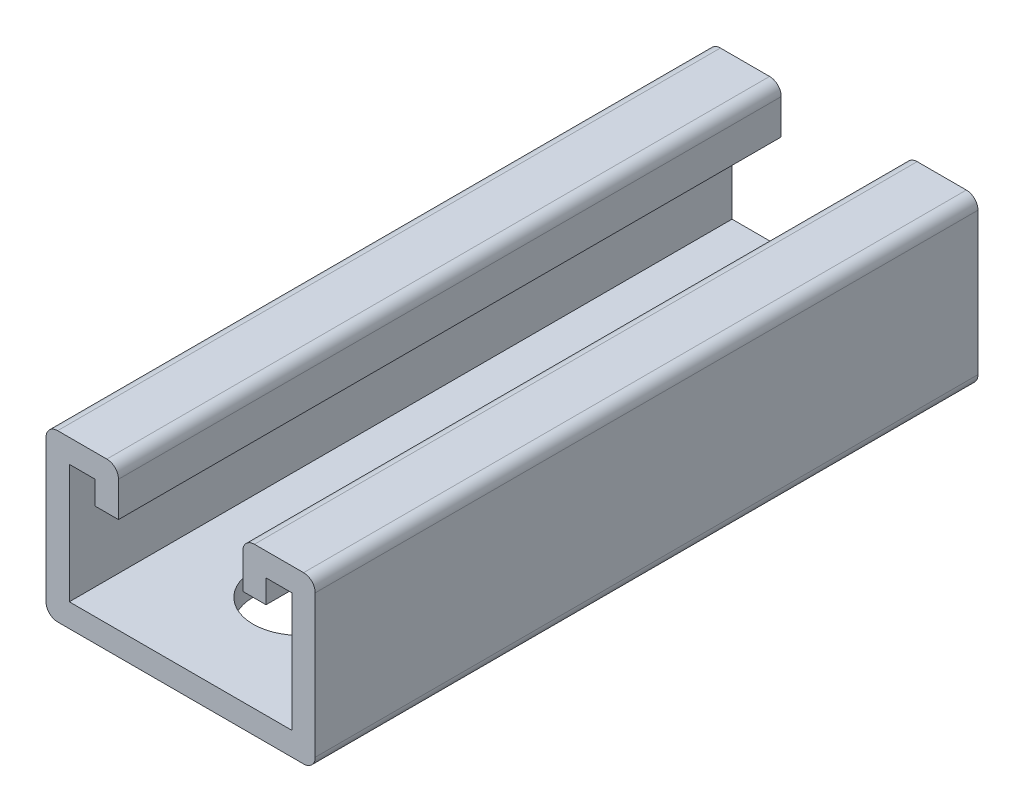
ISO-10303-21;
HEADER;
FILE_DESCRIPTION(('STEP AP214'),'2;1');
FILE_NAME('part.step','',(''),(''),'','','');
FILE_SCHEMA(('AUTOMOTIVE_DESIGN { 1 0 10303 214 1 1 1 1 }'));
ENDSEC;
DATA;
#1=APPLICATION_CONTEXT('core data for automotive mechanical design processes');
#2=APPLICATION_PROTOCOL_DEFINITION('international standard','automotive_design',2000,#1);
#3=PRODUCT_CONTEXT('',#1,'mechanical');
#4=PRODUCT('Part','Part','',(#3));
#5=PRODUCT_RELATED_PRODUCT_CATEGORY('part','',(#4));
#6=PRODUCT_DEFINITION_FORMATION('','',#4);
#7=PRODUCT_DEFINITION_CONTEXT('part definition',#1,'design');
#8=PRODUCT_DEFINITION('design','',#6,#7);
#9=PRODUCT_DEFINITION_SHAPE('','',#8);
#10=(LENGTH_UNIT() NAMED_UNIT(*) SI_UNIT(.MILLI.,.METRE.));
#11=(NAMED_UNIT(*) PLANE_ANGLE_UNIT() SI_UNIT($,.RADIAN.));
#12=(NAMED_UNIT(*) SI_UNIT($,.STERADIAN.) SOLID_ANGLE_UNIT());
#13=UNCERTAINTY_MEASURE_WITH_UNIT(LENGTH_MEASURE(1.E-05),#10,'distance_accuracy_value','');
#14=(GEOMETRIC_REPRESENTATION_CONTEXT(3) GLOBAL_UNCERTAINTY_ASSIGNED_CONTEXT((#13)) GLOBAL_UNIT_ASSIGNED_CONTEXT((#10,
#11,#12)) REPRESENTATION_CONTEXT('',''));
#15=CARTESIAN_POINT('',(0.,0.,0.));
#16=DIRECTION('',(0.,0.,1.));
#17=DIRECTION('',(1.,0.,0.));
#18=AXIS2_PLACEMENT_3D('',#15,#16,#17);
#19=CARTESIAN_POINT('',(9.525,5.55625,101.6));
#20=DIRECTION('',(0.,1.,0.));
#21=DIRECTION('',(0.,0.,1.));
#22=AXIS2_PLACEMENT_3D('',#19,#20,#21);
#23=PLANE('',#22);
#24=DIRECTION('',(1.,0.,0.));
#25=VECTOR('',#24,1.);
#26=CARTESIAN_POINT('',(9.525,5.55625,0.));
#27=LINE('',#26,#25);
#28=CARTESIAN_POINT('',(9.525,5.55625,0.));
#29=VERTEX_POINT('',#28);
#30=CARTESIAN_POINT('',(13.096875,5.55625,0.));
#31=VERTEX_POINT('',#30);
#32=EDGE_CURVE('E295',#29,#31,#27,.T.);
#33=ORIENTED_EDGE('',*,*,#32,.T.);
#34=DIRECTION('',(0.,0.,-1.));
#35=VECTOR('',#34,1.);
#36=CARTESIAN_POINT('',(13.096875,5.55625,101.6));
#37=LINE('',#36,#35);
#38=CARTESIAN_POINT('',(13.096875,5.55625,101.6));
#39=VERTEX_POINT('',#38);
#40=EDGE_CURVE('E11',#39,#31,#37,.T.);
#41=ORIENTED_EDGE('',*,*,#40,.F.);
#42=DIRECTION('',(1.,0.,0.));
#43=VECTOR('',#42,1.);
#44=CARTESIAN_POINT('',(9.525,5.55625,101.6));
#45=LINE('',#44,#43);
#46=CARTESIAN_POINT('',(9.525,5.55625,101.6));
#47=VERTEX_POINT('',#46);
#48=EDGE_CURVE('E296',#47,#39,#45,.T.);
#49=ORIENTED_EDGE('',*,*,#48,.F.);
#50=DIRECTION('',(0.,0.,-1.));
#51=VECTOR('',#50,1.);
#52=CARTESIAN_POINT('',(9.525,5.55625,101.6));
#53=LINE('',#52,#51);
#54=EDGE_CURVE('E342',#47,#29,#53,.T.);
#55=ORIENTED_EDGE('',*,*,#54,.T.);
#56=EDGE_LOOP('',(#33,#41,#49,#55));
#57=FACE_BOUND('',#56,.T.);
#58=ADVANCED_FACE('F32',(#57),#23,.F.);
#59=CARTESIAN_POINT('',(13.096875,9.128125,101.6));
#60=DIRECTION('',(-1.,0.,0.));
#61=DIRECTION('',(0.,0.,1.));
#62=AXIS2_PLACEMENT_3D('',#59,#60,#61);
#63=PLANE('',#62);
#64=DIRECTION('',(0.,1.,0.));
#65=VECTOR('',#64,1.);
#66=CARTESIAN_POINT('',(13.096875,9.128125,0.));
#67=LINE('',#66,#65);
#68=CARTESIAN_POINT('',(13.096875,9.128125,0.));
#69=VERTEX_POINT('',#68);
#70=EDGE_CURVE('E345',#31,#69,#67,.T.);
#71=ORIENTED_EDGE('',*,*,#70,.T.);
#72=DIRECTION('',(0.,0.,-1.));
#73=VECTOR('',#72,1.);
#74=CARTESIAN_POINT('',(13.096875,9.128125,101.6));
#75=LINE('',#74,#73);
#76=CARTESIAN_POINT('',(13.096875,9.128125,101.6));
#77=VERTEX_POINT('',#76);
#78=EDGE_CURVE('E39',#77,#69,#75,.T.);
#79=ORIENTED_EDGE('',*,*,#78,.F.);
#80=DIRECTION('',(0.,1.,0.));
#81=VECTOR('',#80,1.);
#82=CARTESIAN_POINT('',(13.096875,9.128125,101.6));
#83=LINE('',#82,#81);
#84=EDGE_CURVE('E299',#39,#77,#83,.T.);
#85=ORIENTED_EDGE('',*,*,#84,.F.);
#86=ORIENTED_EDGE('',*,*,#40,.T.);
#87=EDGE_LOOP('',(#71,#79,#85,#86));
#88=FACE_BOUND('',#87,.T.);
#89=ADVANCED_FACE('F472',(#88),#63,.F.);
#90=CARTESIAN_POINT('',(17.065625,9.128125,101.6));
#91=DIRECTION('',(0.,1.,0.));
#92=DIRECTION('',(0.,0.,1.));
#93=AXIS2_PLACEMENT_3D('',#90,#91,#92);
#94=PLANE('',#93);
#95=DIRECTION('',(1.,0.,0.));
#96=VECTOR('',#95,1.);
#97=CARTESIAN_POINT('',(17.065625,9.128125,0.));
#98=LINE('',#97,#96);
#99=CARTESIAN_POINT('',(17.065625,9.128125,0.));
#100=VERTEX_POINT('',#99);
#101=EDGE_CURVE('E347',#69,#100,#98,.T.);
#102=ORIENTED_EDGE('',*,*,#101,.T.);
#103=DIRECTION('',(0.,0.,-1.));
#104=VECTOR('',#103,1.);
#105=CARTESIAN_POINT('',(17.065625,9.128125,101.6));
#106=LINE('',#105,#104);
#107=CARTESIAN_POINT('',(17.065625,9.128125,101.6));
#108=VERTEX_POINT('',#107);
#109=EDGE_CURVE('E442',#108,#100,#106,.T.);
#110=ORIENTED_EDGE('',*,*,#109,.F.);
#111=DIRECTION('',(1.,0.,0.));
#112=VECTOR('',#111,1.);
#113=CARTESIAN_POINT('',(17.065625,9.128125,101.6));
#114=LINE('',#113,#112);
#115=EDGE_CURVE('E302',#77,#108,#114,.T.);
#116=ORIENTED_EDGE('',*,*,#115,.F.);
#117=ORIENTED_EDGE('',*,*,#78,.T.);
#118=EDGE_LOOP('',(#102,#110,#116,#117));
#119=FACE_BOUND('',#118,.T.);
#120=ADVANCED_FACE('F449',(#119),#94,.F.);
#121=CARTESIAN_POINT('',(17.065625,-9.128125,101.6));
#122=DIRECTION('',(1.,0.,0.));
#123=DIRECTION('',(0.,1.,0.));
#124=AXIS2_PLACEMENT_3D('',#121,#122,#123);
#125=PLANE('',#124);
#126=DIRECTION('',(0.,-1.,0.));
#127=VECTOR('',#126,1.);
#128=CARTESIAN_POINT('',(17.065625,-9.128125,0.));
#129=LINE('',#128,#127);
#130=CARTESIAN_POINT('',(17.065625,-9.128125,0.));
#131=VERTEX_POINT('',#130);
#132=EDGE_CURVE('E349',#100,#131,#129,.T.);
#133=ORIENTED_EDGE('',*,*,#132,.T.);
#134=DIRECTION('',(0.,0.,-1.));
#135=VECTOR('',#134,1.);
#136=CARTESIAN_POINT('',(17.065625,-9.128125,101.6));
#137=LINE('',#136,#135);
#138=CARTESIAN_POINT('',(17.065625,-9.128125,101.6));
#139=VERTEX_POINT('',#138);
#140=EDGE_CURVE('E439',#139,#131,#137,.T.);
#141=ORIENTED_EDGE('',*,*,#140,.F.);
#142=DIRECTION('',(0.,-1.,0.));
#143=VECTOR('',#142,1.);
#144=CARTESIAN_POINT('',(17.065625,-9.128125,101.6));
#145=LINE('',#144,#143);
#146=EDGE_CURVE('E304',#108,#139,#145,.T.);
#147=ORIENTED_EDGE('',*,*,#146,.F.);
#148=ORIENTED_EDGE('',*,*,#109,.T.);
#149=EDGE_LOOP('',(#133,#141,#147,#148));
#150=FACE_BOUND('',#149,.T.);
#151=ADVANCED_FACE('F460',(#150),#125,.F.);
#152=CARTESIAN_POINT('',(-17.065625,-9.128125,101.6));
#153=DIRECTION('',(0.,-1.,0.));
#154=DIRECTION('',(0.,0.,-1.));
#155=AXIS2_PLACEMENT_3D('',#152,#153,#154);
#156=PLANE('',#155);
#157=DIRECTION('',(0.,0.,1.));
#158=VECTOR('',#157,1.);
#159=CARTESIAN_POINT('',(7.14375,-9.128125,152.4));
#160=LINE('',#159,#158);
#161=CARTESIAN_POINT('',(7.14375,-9.128125,69.05625));
#162=VERTEX_POINT('',#161);
#163=CARTESIAN_POINT('',(7.14375,-9.128125,83.34375));
#164=VERTEX_POINT('',#163);
#165=EDGE_CURVE('E256',#162,#164,#160,.T.);
#166=ORIENTED_EDGE('',*,*,#165,.T.);
#167=CARTESIAN_POINT('',(0.,-9.128125,83.34375));
#168=DIRECTION('',(0.,-1.,0.));
#169=DIRECTION('',(0.,0.,-1.));
#170=AXIS2_PLACEMENT_3D('',#167,#168,#169);
#171=CIRCLE('',#170,7.14375);
#172=CARTESIAN_POINT('',(-7.14375,-9.128125,83.34375));
#173=VERTEX_POINT('',#172);
#174=EDGE_CURVE('E260',#164,#173,#171,.T.);
#175=ORIENTED_EDGE('',*,*,#174,.T.);
#176=DIRECTION('',(0.,0.,-1.));
#177=VECTOR('',#176,1.);
#178=CARTESIAN_POINT('',(-7.14375,-9.128125,152.4));
#179=LINE('',#178,#177);
#180=CARTESIAN_POINT('',(-7.14375,-9.128125,69.05625));
#181=VERTEX_POINT('',#180);
#182=EDGE_CURVE('E237',#173,#181,#179,.T.);
#183=ORIENTED_EDGE('',*,*,#182,.T.);
#184=CARTESIAN_POINT('',(0.,-9.128125,69.05625));
#185=DIRECTION('',(0.,-1.,0.));
#186=DIRECTION('',(0.,0.,-1.));
#187=AXIS2_PLACEMENT_3D('',#184,#185,#186);
#188=CIRCLE('',#187,7.14375);
#189=EDGE_CURVE('E46',#181,#162,#188,.T.);
#190=ORIENTED_EDGE('',*,*,#189,.T.);
#191=EDGE_LOOP('',(#166,#175,#183,#190));
#192=FACE_BOUND('',#191,.T.);
#193=DIRECTION('',(0.,0.,1.));
#194=VECTOR('',#193,1.);
#195=CARTESIAN_POINT('',(7.14375,-9.128125,101.6));
#196=LINE('',#195,#194);
#197=CARTESIAN_POINT('',(7.14375,-9.128125,18.25625));
#198=VERTEX_POINT('',#197);
#199=CARTESIAN_POINT('',(7.14375,-9.128125,32.54375));
#200=VERTEX_POINT('',#199);
#201=EDGE_CURVE('E289',#198,#200,#196,.T.);
#202=ORIENTED_EDGE('',*,*,#201,.T.);
#203=CARTESIAN_POINT('',(0.,-9.128125,32.54375));
#204=DIRECTION('',(0.,-1.,0.));
#205=DIRECTION('',(0.,0.,-1.));
#206=AXIS2_PLACEMENT_3D('',#203,#204,#205);
#207=CIRCLE('',#206,7.14375);
#208=CARTESIAN_POINT('',(-7.14375,-9.128125,32.54375));
#209=VERTEX_POINT('',#208);
#210=EDGE_CURVE('E292',#200,#209,#207,.T.);
#211=ORIENTED_EDGE('',*,*,#210,.T.);
#212=DIRECTION('',(0.,0.,-1.));
#213=VECTOR('',#212,1.);
#214=CARTESIAN_POINT('',(-7.14375,-9.128125,101.6));
#215=LINE('',#214,#213);
#216=CARTESIAN_POINT('',(-7.14375,-9.128125,18.25625));
#217=VERTEX_POINT('',#216);
#218=EDGE_CURVE('E277',#209,#217,#215,.T.);
#219=ORIENTED_EDGE('',*,*,#218,.T.);
#220=CARTESIAN_POINT('',(0.,-9.128125,18.25625));
#221=DIRECTION('',(0.,-1.,0.));
#222=DIRECTION('',(0.,0.,-1.));
#223=AXIS2_PLACEMENT_3D('',#220,#221,#222);
#224=CIRCLE('',#223,7.14375);
#225=EDGE_CURVE('E286',#217,#198,#224,.T.);
#226=ORIENTED_EDGE('',*,*,#225,.T.);
#227=EDGE_LOOP('',(#202,#211,#219,#226));
#228=FACE_BOUND('',#227,.T.);
#229=DIRECTION('',(-1.,0.,0.));
#230=VECTOR('',#229,1.);
#231=CARTESIAN_POINT('',(-17.065625,-9.128125,0.));
#232=LINE('',#231,#230);
#233=CARTESIAN_POINT('',(-17.065625,-9.128125,0.));
#234=VERTEX_POINT('',#233);
#235=EDGE_CURVE('E351',#131,#234,#232,.T.);
#236=ORIENTED_EDGE('',*,*,#235,.T.);
#237=DIRECTION('',(0.,0.,-1.));
#238=VECTOR('',#237,1.);
#239=CARTESIAN_POINT('',(-17.065625,-9.128125,101.6));
#240=LINE('',#239,#238);
#241=CARTESIAN_POINT('',(-17.065625,-9.128125,101.6));
#242=VERTEX_POINT('',#241);
#243=EDGE_CURVE('E436',#242,#234,#240,.T.);
#244=ORIENTED_EDGE('',*,*,#243,.F.);
#245=DIRECTION('',(-1.,0.,0.));
#246=VECTOR('',#245,1.);
#247=CARTESIAN_POINT('',(-17.065625,-9.128125,101.6));
#248=LINE('',#247,#246);
#249=EDGE_CURVE('E306',#139,#242,#248,.T.);
#250=ORIENTED_EDGE('',*,*,#249,.F.);
#251=ORIENTED_EDGE('',*,*,#140,.T.);
#252=EDGE_LOOP('',(#236,#244,#250,#251));
#253=FACE_BOUND('',#252,.T.);
#254=ADVANCED_FACE('F464',(#192,#228,#253),#156,.F.);
#255=CARTESIAN_POINT('',(-17.065625,9.128125,101.6));
#256=DIRECTION('',(-1.,0.,0.));
#257=DIRECTION('',(0.,-1.,0.));
#258=AXIS2_PLACEMENT_3D('',#255,#256,#257);
#259=PLANE('',#258);
#260=DIRECTION('',(0.,1.,0.));
#261=VECTOR('',#260,1.);
#262=CARTESIAN_POINT('',(-17.065625,9.128125,0.));
#263=LINE('',#262,#261);
#264=CARTESIAN_POINT('',(-17.065625,9.128125,0.));
#265=VERTEX_POINT('',#264);
#266=EDGE_CURVE('E353',#234,#265,#263,.T.);
#267=ORIENTED_EDGE('',*,*,#266,.T.);
#268=DIRECTION('',(0.,0.,-1.));
#269=VECTOR('',#268,1.);
#270=CARTESIAN_POINT('',(-17.065625,9.128125,101.6));
#271=LINE('',#270,#269);
#272=CARTESIAN_POINT('',(-17.065625,9.128125,101.6));
#273=VERTEX_POINT('',#272);
#274=EDGE_CURVE('E433',#273,#265,#271,.T.);
#275=ORIENTED_EDGE('',*,*,#274,.F.);
#276=DIRECTION('',(0.,1.,0.));
#277=VECTOR('',#276,1.);
#278=CARTESIAN_POINT('',(-17.065625,9.128125,101.6));
#279=LINE('',#278,#277);
#280=EDGE_CURVE('E308',#242,#273,#279,.T.);
#281=ORIENTED_EDGE('',*,*,#280,.F.);
#282=ORIENTED_EDGE('',*,*,#243,.T.);
#283=EDGE_LOOP('',(#267,#275,#281,#282));
#284=FACE_BOUND('',#283,.T.);
#285=ADVANCED_FACE('F554',(#284),#259,.F.);
#286=CARTESIAN_POINT('',(-13.096875,9.128125,101.6));
#287=DIRECTION('',(0.,1.,0.));
#288=DIRECTION('',(0.,0.,1.));
#289=AXIS2_PLACEMENT_3D('',#286,#287,#288);
#290=PLANE('',#289);
#291=DIRECTION('',(1.,0.,0.));
#292=VECTOR('',#291,1.);
#293=CARTESIAN_POINT('',(-13.096875,9.128125,0.));
#294=LINE('',#293,#292);
#295=CARTESIAN_POINT('',(-13.096875,9.128125,0.));
#296=VERTEX_POINT('',#295);
#297=EDGE_CURVE('E355',#265,#296,#294,.T.);
#298=ORIENTED_EDGE('',*,*,#297,.T.);
#299=DIRECTION('',(0.,0.,-1.));
#300=VECTOR('',#299,1.);
#301=CARTESIAN_POINT('',(-13.096875,9.128125,101.6));
#302=LINE('',#301,#300);
#303=CARTESIAN_POINT('',(-13.096875,9.128125,101.6));
#304=VERTEX_POINT('',#303);
#305=EDGE_CURVE('E430',#304,#296,#302,.T.);
#306=ORIENTED_EDGE('',*,*,#305,.F.);
#307=DIRECTION('',(1.,0.,0.));
#308=VECTOR('',#307,1.);
#309=CARTESIAN_POINT('',(-13.096875,9.128125,101.6));
#310=LINE('',#309,#308);
#311=EDGE_CURVE('E310',#273,#304,#310,.T.);
#312=ORIENTED_EDGE('',*,*,#311,.F.);
#313=ORIENTED_EDGE('',*,*,#274,.T.);
#314=EDGE_LOOP('',(#298,#306,#312,#313));
#315=FACE_BOUND('',#314,.T.);
#316=ADVANCED_FACE('F551',(#315),#290,.F.);
#317=CARTESIAN_POINT('',(-13.096875,9.128125,101.6));
#318=DIRECTION('',(1.,0.,0.));
#319=DIRECTION('',(0.,0.,-1.));
#320=AXIS2_PLACEMENT_3D('',#317,#318,#319);
#321=PLANE('',#320);
#322=DIRECTION('',(0.,-1.,0.));
#323=VECTOR('',#322,1.);
#324=CARTESIAN_POINT('',(-13.096875,9.128125,0.));
#325=LINE('',#324,#323);
#326=CARTESIAN_POINT('',(-13.096875,5.55625,0.));
#327=VERTEX_POINT('',#326);
#328=EDGE_CURVE('E357',#296,#327,#325,.T.);
#329=ORIENTED_EDGE('',*,*,#328,.T.);
#330=DIRECTION('',(0.,0.,-1.));
#331=VECTOR('',#330,1.);
#332=CARTESIAN_POINT('',(-13.096875,5.55625,101.6));
#333=LINE('',#332,#331);
#334=CARTESIAN_POINT('',(-13.096875,5.55625,101.6));
#335=VERTEX_POINT('',#334);
#336=EDGE_CURVE('E427',#335,#327,#333,.T.);
#337=ORIENTED_EDGE('',*,*,#336,.F.);
#338=DIRECTION('',(0.,-1.,0.));
#339=VECTOR('',#338,1.);
#340=CARTESIAN_POINT('',(-13.096875,9.128125,101.6));
#341=LINE('',#340,#339);
#342=EDGE_CURVE('E312',#304,#335,#341,.T.);
#343=ORIENTED_EDGE('',*,*,#342,.F.);
#344=ORIENTED_EDGE('',*,*,#305,.T.);
#345=EDGE_LOOP('',(#329,#337,#343,#344));
#346=FACE_BOUND('',#345,.T.);
#347=ADVANCED_FACE('F547',(#346),#321,.F.);
#348=CARTESIAN_POINT('',(-13.096875,5.55625,101.6));
#349=DIRECTION('',(0.,1.,0.));
#350=DIRECTION('',(0.,0.,1.));
#351=AXIS2_PLACEMENT_3D('',#348,#349,#350);
#352=PLANE('',#351);
#353=DIRECTION('',(1.,0.,0.));
#354=VECTOR('',#353,1.);
#355=CARTESIAN_POINT('',(-13.096875,5.55625,0.));
#356=LINE('',#355,#354);
#357=CARTESIAN_POINT('',(-9.525,5.55625,0.));
#358=VERTEX_POINT('',#357);
#359=EDGE_CURVE('E359',#327,#358,#356,.T.);
#360=ORIENTED_EDGE('',*,*,#359,.T.);
#361=DIRECTION('',(0.,0.,-1.));
#362=VECTOR('',#361,1.);
#363=CARTESIAN_POINT('',(-9.525,5.55625,101.6));
#364=LINE('',#363,#362);
#365=CARTESIAN_POINT('',(-9.525,5.55625,101.6));
#366=VERTEX_POINT('',#365);
#367=EDGE_CURVE('E424',#366,#358,#364,.T.);
#368=ORIENTED_EDGE('',*,*,#367,.F.);
#369=DIRECTION('',(1.,0.,0.));
#370=VECTOR('',#369,1.);
#371=CARTESIAN_POINT('',(-13.096875,5.55625,101.6));
#372=LINE('',#371,#370);
#373=EDGE_CURVE('E314',#335,#366,#372,.T.);
#374=ORIENTED_EDGE('',*,*,#373,.F.);
#375=ORIENTED_EDGE('',*,*,#336,.T.);
#376=EDGE_LOOP('',(#360,#368,#374,#375));
#377=FACE_BOUND('',#376,.T.);
#378=ADVANCED_FACE('F543',(#377),#352,.F.);
#379=CARTESIAN_POINT('',(-9.525,10.9140625,101.6));
#380=DIRECTION('',(-1.,0.,0.));
#381=DIRECTION('',(0.,0.,1.));
#382=AXIS2_PLACEMENT_3D('',#379,#380,#381);
#383=PLANE('',#382);
#384=DIRECTION('',(0.,1.,0.));
#385=VECTOR('',#384,1.);
#386=CARTESIAN_POINT('',(-9.525,10.9140625,0.));
#387=LINE('',#386,#385);
#388=CARTESIAN_POINT('',(-9.525,10.9140625,0.));
#389=VERTEX_POINT('',#388);
#390=EDGE_CURVE('E361',#358,#389,#387,.T.);
#391=ORIENTED_EDGE('',*,*,#390,.T.);
#392=DIRECTION('',(0.,0.,-1.));
#393=VECTOR('',#392,1.);
#394=CARTESIAN_POINT('',(-9.525,10.9140625,101.6));
#395=LINE('',#394,#393);
#396=CARTESIAN_POINT('',(-9.525,10.9140625,101.6));
#397=VERTEX_POINT('',#396);
#398=EDGE_CURVE('E421',#397,#389,#395,.T.);
#399=ORIENTED_EDGE('',*,*,#398,.F.);
#400=DIRECTION('',(0.,1.,0.));
#401=VECTOR('',#400,1.);
#402=CARTESIAN_POINT('',(-9.525,10.9140625,101.6));
#403=LINE('',#402,#401);
#404=EDGE_CURVE('E316',#366,#397,#403,.T.);
#405=ORIENTED_EDGE('',*,*,#404,.F.);
#406=ORIENTED_EDGE('',*,*,#367,.T.);
#407=EDGE_LOOP('',(#391,#399,#405,#406));
#408=FACE_BOUND('',#407,.T.);
#409=ADVANCED_FACE('F538',(#408),#383,.F.);
#410=CARTESIAN_POINT('',(-11.3109375,10.9140625,101.6));
#411=DIRECTION('',(0.,0.,-1.));
#412=DIRECTION('',(-1.,0.,0.));
#413=AXIS2_PLACEMENT_3D('',#410,#411,#412);
#414=CYLINDRICAL_SURFACE('',#413,1.7859375);
#415=CARTESIAN_POINT('',(-11.3109375,10.9140625,0.));
#416=DIRECTION('',(0.,0.,1.));
#417=DIRECTION('',(-1.,0.,0.));
#418=AXIS2_PLACEMENT_3D('',#415,#416,#417);
#419=CIRCLE('',#418,1.7859375);
#420=CARTESIAN_POINT('',(-11.3109375,12.7,0.));
#421=VERTEX_POINT('',#420);
#422=EDGE_CURVE('E363',#389,#421,#419,.T.);
#423=ORIENTED_EDGE('',*,*,#422,.T.);
#424=DIRECTION('',(0.,0.,-1.));
#425=VECTOR('',#424,1.);
#426=CARTESIAN_POINT('',(-11.3109375,12.7,101.6));
#427=LINE('',#426,#425);
#428=CARTESIAN_POINT('',(-11.3109375,12.7,101.6));
#429=VERTEX_POINT('',#428);
#430=EDGE_CURVE('E418',#429,#421,#427,.T.);
#431=ORIENTED_EDGE('',*,*,#430,.F.);
#432=CARTESIAN_POINT('',(-11.3109375,10.9140625,101.6));
#433=DIRECTION('',(0.,0.,1.));
#434=DIRECTION('',(-1.,0.,0.));
#435=AXIS2_PLACEMENT_3D('',#432,#433,#434);
#436=CIRCLE('',#435,1.7859375);
#437=EDGE_CURVE('E318',#397,#429,#436,.T.);
#438=ORIENTED_EDGE('',*,*,#437,.F.);
#439=ORIENTED_EDGE('',*,*,#398,.T.);
#440=EDGE_LOOP('',(#423,#431,#438,#439));
#441=FACE_BOUND('',#440,.T.);
#442=ADVANCED_FACE('F532',(#441),#414,.T.);
#443=CARTESIAN_POINT('',(-11.3109375,12.7,101.6));
#444=DIRECTION('',(0.,-1.,0.));
#445=DIRECTION('',(0.,0.,-1.));
#446=AXIS2_PLACEMENT_3D('',#443,#444,#445);
#447=PLANE('',#446);
#448=DIRECTION('',(-1.,0.,0.));
#449=VECTOR('',#448,1.);
#450=CARTESIAN_POINT('',(-11.3109375,12.7,0.));
#451=LINE('',#450,#449);
#452=CARTESIAN_POINT('',(-18.8515625,12.7,0.));
#453=VERTEX_POINT('',#452);
#454=EDGE_CURVE('E365',#421,#453,#451,.T.);
#455=ORIENTED_EDGE('',*,*,#454,.T.);
#456=DIRECTION('',(0.,0.,-1.));
#457=VECTOR('',#456,1.);
#458=CARTESIAN_POINT('',(-18.8515625,12.7,101.6));
#459=LINE('',#458,#457);
#460=CARTESIAN_POINT('',(-18.8515625,12.7,101.6));
#461=VERTEX_POINT('',#460);
#462=EDGE_CURVE('E415',#461,#453,#459,.T.);
#463=ORIENTED_EDGE('',*,*,#462,.F.);
#464=DIRECTION('',(-1.,0.,0.));
#465=VECTOR('',#464,1.);
#466=CARTESIAN_POINT('',(-11.3109375,12.7,101.6));
#467=LINE('',#466,#465);
#468=EDGE_CURVE('E320',#429,#461,#467,.T.);
#469=ORIENTED_EDGE('',*,*,#468,.F.);
#470=ORIENTED_EDGE('',*,*,#430,.T.);
#471=EDGE_LOOP('',(#455,#463,#469,#470));
#472=FACE_BOUND('',#471,.T.);
#473=ADVANCED_FACE('F528',(#472),#447,.F.);
#474=CARTESIAN_POINT('',(-18.8515625,10.9140625,101.6));
#475=DIRECTION('',(0.,0.,-1.));
#476=DIRECTION('',(-1.,0.,0.));
#477=AXIS2_PLACEMENT_3D('',#474,#475,#476);
#478=CYLINDRICAL_SURFACE('',#477,1.7859375);
#479=CARTESIAN_POINT('',(-18.8515625,10.9140625,0.));
#480=DIRECTION('',(0.,0.,1.));
#481=DIRECTION('',(-1.,0.,0.));
#482=AXIS2_PLACEMENT_3D('',#479,#480,#481);
#483=CIRCLE('',#482,1.7859375);
#484=CARTESIAN_POINT('',(-20.6375,10.9140625,0.));
#485=VERTEX_POINT('',#484);
#486=EDGE_CURVE('E367',#453,#485,#483,.T.);
#487=ORIENTED_EDGE('',*,*,#486,.T.);
#488=DIRECTION('',(0.,0.,-1.));
#489=VECTOR('',#488,1.);
#490=CARTESIAN_POINT('',(-20.6375,10.9140625,101.6));
#491=LINE('',#490,#489);
#492=CARTESIAN_POINT('',(-20.6375,10.9140625,101.6));
#493=VERTEX_POINT('',#492);
#494=EDGE_CURVE('E412',#493,#485,#491,.T.);
#495=ORIENTED_EDGE('',*,*,#494,.F.);
#496=CARTESIAN_POINT('',(-18.8515625,10.9140625,101.6));
#497=DIRECTION('',(0.,0.,1.));
#498=DIRECTION('',(-1.,0.,0.));
#499=AXIS2_PLACEMENT_3D('',#496,#497,#498);
#500=CIRCLE('',#499,1.7859375);
#501=EDGE_CURVE('E322',#461,#493,#500,.T.);
#502=ORIENTED_EDGE('',*,*,#501,.F.);
#503=ORIENTED_EDGE('',*,*,#462,.T.);
#504=EDGE_LOOP('',(#487,#495,#502,#503));
#505=FACE_BOUND('',#504,.T.);
#506=ADVANCED_FACE('F523',(#505),#478,.T.);
#507=CARTESIAN_POINT('',(-20.6375,10.9140625,101.6));
#508=DIRECTION('',(1.,0.,0.));
#509=DIRECTION('',(0.,0.,-1.));
#510=AXIS2_PLACEMENT_3D('',#507,#508,#509);
#511=PLANE('',#510);
#512=DIRECTION('',(0.,-1.,0.));
#513=VECTOR('',#512,1.);
#514=CARTESIAN_POINT('',(-20.6375,10.9140625,0.));
#515=LINE('',#514,#513);
#516=CARTESIAN_POINT('',(-20.6375,-10.9140625,0.));
#517=VERTEX_POINT('',#516);
#518=EDGE_CURVE('E369',#485,#517,#515,.T.);
#519=ORIENTED_EDGE('',*,*,#518,.T.);
#520=DIRECTION('',(0.,0.,-1.));
#521=VECTOR('',#520,1.);
#522=CARTESIAN_POINT('',(-20.6375,-10.9140625,101.6));
#523=LINE('',#522,#521);
#524=CARTESIAN_POINT('',(-20.6375,-10.9140625,101.6));
#525=VERTEX_POINT('',#524);
#526=EDGE_CURVE('E409',#525,#517,#523,.T.);
#527=ORIENTED_EDGE('',*,*,#526,.F.);
#528=DIRECTION('',(0.,-1.,0.));
#529=VECTOR('',#528,1.);
#530=CARTESIAN_POINT('',(-20.6375,10.9140625,101.6));
#531=LINE('',#530,#529);
#532=EDGE_CURVE('E324',#493,#525,#531,.T.);
#533=ORIENTED_EDGE('',*,*,#532,.F.);
#534=ORIENTED_EDGE('',*,*,#494,.T.);
#535=EDGE_LOOP('',(#519,#527,#533,#534));
#536=FACE_BOUND('',#535,.T.);
#537=ADVANCED_FACE('F517',(#536),#511,.F.);
#538=CARTESIAN_POINT('',(-18.8515625,-10.9140625,101.6));
#539=DIRECTION('',(0.,0.,-1.));
#540=DIRECTION('',(-1.,0.,0.));
#541=AXIS2_PLACEMENT_3D('',#538,#539,#540);
#542=CYLINDRICAL_SURFACE('',#541,1.7859375);
#543=CARTESIAN_POINT('',(-18.8515625,-10.9140625,0.));
#544=DIRECTION('',(0.,0.,1.));
#545=DIRECTION('',(-1.,0.,0.));
#546=AXIS2_PLACEMENT_3D('',#543,#544,#545);
#547=CIRCLE('',#546,1.7859375);
#548=CARTESIAN_POINT('',(-18.8515625,-12.7,0.));
#549=VERTEX_POINT('',#548);
#550=EDGE_CURVE('E371',#517,#549,#547,.T.);
#551=ORIENTED_EDGE('',*,*,#550,.T.);
#552=DIRECTION('',(0.,0.,-1.));
#553=VECTOR('',#552,1.);
#554=CARTESIAN_POINT('',(-18.8515625,-12.7,101.6));
#555=LINE('',#554,#553);
#556=CARTESIAN_POINT('',(-18.8515625,-12.7,101.6));
#557=VERTEX_POINT('',#556);
#558=EDGE_CURVE('E406',#557,#549,#555,.T.);
#559=ORIENTED_EDGE('',*,*,#558,.F.);
#560=CARTESIAN_POINT('',(-18.8515625,-10.9140625,101.6));
#561=DIRECTION('',(0.,0.,1.));
#562=DIRECTION('',(-1.,0.,0.));
#563=AXIS2_PLACEMENT_3D('',#560,#561,#562);
#564=CIRCLE('',#563,1.7859375);
#565=EDGE_CURVE('E326',#525,#557,#564,.T.);
#566=ORIENTED_EDGE('',*,*,#565,.F.);
#567=ORIENTED_EDGE('',*,*,#526,.T.);
#568=EDGE_LOOP('',(#551,#559,#566,#567));
#569=FACE_BOUND('',#568,.T.);
#570=ADVANCED_FACE('F513',(#569),#542,.T.);
#571=CARTESIAN_POINT('',(-18.8515625,-12.7,101.6));
#572=DIRECTION('',(0.,1.,0.));
#573=DIRECTION('',(-1.,0.,0.));
#574=AXIS2_PLACEMENT_3D('',#571,#572,#573);
#575=PLANE('',#574);
#576=DIRECTION('',(0.,0.,-1.));
#577=VECTOR('',#576,1.);
#578=CARTESIAN_POINT('',(-7.14375,-12.7,69.05625));
#579=LINE('',#578,#577);
#580=CARTESIAN_POINT('',(-7.14375,-12.7,83.34375));
#581=VERTEX_POINT('',#580);
#582=CARTESIAN_POINT('',(-7.14375,-12.7,69.05625));
#583=VERTEX_POINT('',#582);
#584=EDGE_CURVE('E230',#581,#583,#579,.T.);
#585=ORIENTED_EDGE('',*,*,#584,.F.);
#586=CARTESIAN_POINT('',(0.,-12.7,83.34375));
#587=DIRECTION('',(0.,-1.,0.));
#588=DIRECTION('',(1.,0.,0.));
#589=AXIS2_PLACEMENT_3D('',#586,#587,#588);
#590=CIRCLE('',#589,7.14375);
#591=CARTESIAN_POINT('',(7.14375,-12.7,83.34375));
#592=VERTEX_POINT('',#591);
#593=EDGE_CURVE('E54',#592,#581,#590,.T.);
#594=ORIENTED_EDGE('',*,*,#593,.F.);
#595=DIRECTION('',(0.,0.,1.));
#596=VECTOR('',#595,1.);
#597=CARTESIAN_POINT('',(7.14375,-12.7,83.34375));
#598=LINE('',#597,#596);
#599=CARTESIAN_POINT('',(7.14375,-12.7,69.05625));
#600=VERTEX_POINT('',#599);
#601=EDGE_CURVE('E246',#600,#592,#598,.T.);
#602=ORIENTED_EDGE('',*,*,#601,.F.);
#603=CARTESIAN_POINT('',(0.,-12.7,69.05625));
#604=DIRECTION('',(0.,-1.,0.));
#605=DIRECTION('',(1.,0.,0.));
#606=AXIS2_PLACEMENT_3D('',#603,#604,#605);
#607=CIRCLE('',#606,7.14375);
#608=EDGE_CURVE('E240',#583,#600,#607,.T.);
#609=ORIENTED_EDGE('',*,*,#608,.F.);
#610=EDGE_LOOP('',(#585,#594,#602,#609));
#611=FACE_BOUND('',#610,.T.);
#612=DIRECTION('',(0.,0.,-1.));
#613=VECTOR('',#612,1.);
#614=CARTESIAN_POINT('',(-7.14375,-12.7,18.25625));
#615=LINE('',#614,#613);
#616=CARTESIAN_POINT('',(-7.14375,-12.7,32.54375));
#617=VERTEX_POINT('',#616);
#618=CARTESIAN_POINT('',(-7.14375,-12.7,18.25625));
#619=VERTEX_POINT('',#618);
#620=EDGE_CURVE('E265',#617,#619,#615,.T.);
#621=ORIENTED_EDGE('',*,*,#620,.F.);
#622=CARTESIAN_POINT('',(0.,-12.7,32.54375));
#623=DIRECTION('',(0.,-1.,0.));
#624=DIRECTION('',(1.,0.,0.));
#625=AXIS2_PLACEMENT_3D('',#622,#623,#624);
#626=CIRCLE('',#625,7.14375);
#627=CARTESIAN_POINT('',(7.14375,-12.7,32.54375));
#628=VERTEX_POINT('',#627);
#629=EDGE_CURVE('E263',#628,#617,#626,.T.);
#630=ORIENTED_EDGE('',*,*,#629,.F.);
#631=DIRECTION('',(0.,0.,1.));
#632=VECTOR('',#631,1.);
#633=CARTESIAN_POINT('',(7.14375,-12.7,32.54375));
#634=LINE('',#633,#632);
#635=CARTESIAN_POINT('',(7.14375,-12.7,18.25625));
#636=VERTEX_POINT('',#635);
#637=EDGE_CURVE('E271',#636,#628,#634,.T.);
#638=ORIENTED_EDGE('',*,*,#637,.F.);
#639=CARTESIAN_POINT('',(0.,-12.7,18.25625));
#640=DIRECTION('',(0.,-1.,0.));
#641=DIRECTION('',(1.,0.,0.));
#642=AXIS2_PLACEMENT_3D('',#639,#640,#641);
#643=CIRCLE('',#642,7.14375);
#644=EDGE_CURVE('E268',#619,#636,#643,.T.);
#645=ORIENTED_EDGE('',*,*,#644,.F.);
#646=EDGE_LOOP('',(#621,#630,#638,#645));
#647=FACE_BOUND('',#646,.T.);
#648=DIRECTION('',(1.,0.,0.));
#649=VECTOR('',#648,1.);
#650=CARTESIAN_POINT('',(-18.8515625,-12.7,0.));
#651=LINE('',#650,#649);
#652=CARTESIAN_POINT('',(18.8515625,-12.7,0.));
#653=VERTEX_POINT('',#652);
#654=EDGE_CURVE('E373',#549,#653,#651,.T.);
#655=ORIENTED_EDGE('',*,*,#654,.T.);
#656=DIRECTION('',(0.,0.,-1.));
#657=VECTOR('',#656,1.);
#658=CARTESIAN_POINT('',(18.8515625,-12.7,101.6));
#659=LINE('',#658,#657);
#660=CARTESIAN_POINT('',(18.8515625,-12.7,101.6));
#661=VERTEX_POINT('',#660);
#662=EDGE_CURVE('E403',#661,#653,#659,.T.);
#663=ORIENTED_EDGE('',*,*,#662,.F.);
#664=DIRECTION('',(1.,0.,0.));
#665=VECTOR('',#664,1.);
#666=CARTESIAN_POINT('',(-18.8515625,-12.7,101.6));
#667=LINE('',#666,#665);
#668=EDGE_CURVE('E328',#557,#661,#667,.T.);
#669=ORIENTED_EDGE('',*,*,#668,.F.);
#670=ORIENTED_EDGE('',*,*,#558,.T.);
#671=EDGE_LOOP('',(#655,#663,#669,#670));
#672=FACE_BOUND('',#671,.T.);
#673=ADVANCED_FACE('F244',(#611,#647,#672),#575,.F.);
#674=CARTESIAN_POINT('',(18.8515625,-10.9140625,101.6));
#675=DIRECTION('',(0.,0.,-1.));
#676=DIRECTION('',(-1.,0.,0.));
#677=AXIS2_PLACEMENT_3D('',#674,#675,#676);
#678=CYLINDRICAL_SURFACE('',#677,1.7859375);
#679=CARTESIAN_POINT('',(18.8515625,-10.9140625,0.));
#680=DIRECTION('',(0.,0.,1.));
#681=DIRECTION('',(-1.,0.,0.));
#682=AXIS2_PLACEMENT_3D('',#679,#680,#681);
#683=CIRCLE('',#682,1.7859375);
#684=CARTESIAN_POINT('',(20.6375,-10.9140625,0.));
#685=VERTEX_POINT('',#684);
#686=EDGE_CURVE('E375',#653,#685,#683,.T.);
#687=ORIENTED_EDGE('',*,*,#686,.T.);
#688=DIRECTION('',(0.,0.,-1.));
#689=VECTOR('',#688,1.);
#690=CARTESIAN_POINT('',(20.6375,-10.9140625,101.6));
#691=LINE('',#690,#689);
#692=CARTESIAN_POINT('',(20.6375,-10.9140625,101.6));
#693=VERTEX_POINT('',#692);
#694=EDGE_CURVE('E400',#693,#685,#691,.T.);
#695=ORIENTED_EDGE('',*,*,#694,.F.);
#696=CARTESIAN_POINT('',(18.8515625,-10.9140625,101.6));
#697=DIRECTION('',(0.,0.,1.));
#698=DIRECTION('',(-1.,0.,0.));
#699=AXIS2_PLACEMENT_3D('',#696,#697,#698);
#700=CIRCLE('',#699,1.7859375);
#701=EDGE_CURVE('E330',#661,#693,#700,.T.);
#702=ORIENTED_EDGE('',*,*,#701,.F.);
#703=ORIENTED_EDGE('',*,*,#662,.T.);
#704=EDGE_LOOP('',(#687,#695,#702,#703));
#705=FACE_BOUND('',#704,.T.);
#706=ADVANCED_FACE('F503',(#705),#678,.T.);
#707=CARTESIAN_POINT('',(20.6375,-10.9140625,101.6));
#708=DIRECTION('',(-1.,0.,0.));
#709=DIRECTION('',(0.,-1.,0.));
#710=AXIS2_PLACEMENT_3D('',#707,#708,#709);
#711=PLANE('',#710);
#712=DIRECTION('',(0.,1.,0.));
#713=VECTOR('',#712,1.);
#714=CARTESIAN_POINT('',(20.6375,-10.9140625,0.));
#715=LINE('',#714,#713);
#716=CARTESIAN_POINT('',(20.6375,10.9140625,0.));
#717=VERTEX_POINT('',#716);
#718=EDGE_CURVE('E377',#685,#717,#715,.T.);
#719=ORIENTED_EDGE('',*,*,#718,.T.);
#720=DIRECTION('',(0.,0.,-1.));
#721=VECTOR('',#720,1.);
#722=CARTESIAN_POINT('',(20.6375,10.9140625,101.6));
#723=LINE('',#722,#721);
#724=CARTESIAN_POINT('',(20.6375,10.9140625,101.6));
#725=VERTEX_POINT('',#724);
#726=EDGE_CURVE('E397',#725,#717,#723,.T.);
#727=ORIENTED_EDGE('',*,*,#726,.F.);
#728=DIRECTION('',(0.,1.,0.));
#729=VECTOR('',#728,1.);
#730=CARTESIAN_POINT('',(20.6375,-10.9140625,101.6));
#731=LINE('',#730,#729);
#732=EDGE_CURVE('E332',#693,#725,#731,.T.);
#733=ORIENTED_EDGE('',*,*,#732,.F.);
#734=ORIENTED_EDGE('',*,*,#694,.T.);
#735=EDGE_LOOP('',(#719,#727,#733,#734));
#736=FACE_BOUND('',#735,.T.);
#737=ADVANCED_FACE('F499',(#736),#711,.F.);
#738=CARTESIAN_POINT('',(18.8515625,10.9140625,101.6));
#739=DIRECTION('',(0.,0.,-1.));
#740=DIRECTION('',(-1.,0.,0.));
#741=AXIS2_PLACEMENT_3D('',#738,#739,#740);
#742=CYLINDRICAL_SURFACE('',#741,1.7859375);
#743=CARTESIAN_POINT('',(18.8515625,10.9140625,0.));
#744=DIRECTION('',(0.,0.,1.));
#745=DIRECTION('',(-1.,0.,0.));
#746=AXIS2_PLACEMENT_3D('',#743,#744,#745);
#747=CIRCLE('',#746,1.7859375);
#748=CARTESIAN_POINT('',(18.8515625,12.7,0.));
#749=VERTEX_POINT('',#748);
#750=EDGE_CURVE('E379',#717,#749,#747,.T.);
#751=ORIENTED_EDGE('',*,*,#750,.T.);
#752=DIRECTION('',(0.,0.,-1.));
#753=VECTOR('',#752,1.);
#754=CARTESIAN_POINT('',(18.8515625,12.7,101.6));
#755=LINE('',#754,#753);
#756=CARTESIAN_POINT('',(18.8515625,12.7,101.6));
#757=VERTEX_POINT('',#756);
#758=EDGE_CURVE('E394',#757,#749,#755,.T.);
#759=ORIENTED_EDGE('',*,*,#758,.F.);
#760=CARTESIAN_POINT('',(18.8515625,10.9140625,101.6));
#761=DIRECTION('',(0.,0.,1.));
#762=DIRECTION('',(-1.,0.,0.));
#763=AXIS2_PLACEMENT_3D('',#760,#761,#762);
#764=CIRCLE('',#763,1.7859375);
#765=EDGE_CURVE('E334',#725,#757,#764,.T.);
#766=ORIENTED_EDGE('',*,*,#765,.F.);
#767=ORIENTED_EDGE('',*,*,#726,.T.);
#768=EDGE_LOOP('',(#751,#759,#766,#767));
#769=FACE_BOUND('',#768,.T.);
#770=ADVANCED_FACE('F494',(#769),#742,.T.);
#771=CARTESIAN_POINT('',(18.8515625,12.7,101.6));
#772=DIRECTION('',(0.,-1.,0.));
#773=DIRECTION('',(0.,0.,-1.));
#774=AXIS2_PLACEMENT_3D('',#771,#772,#773);
#775=PLANE('',#774);
#776=DIRECTION('',(-1.,0.,0.));
#777=VECTOR('',#776,1.);
#778=CARTESIAN_POINT('',(18.8515625,12.7,0.));
#779=LINE('',#778,#777);
#780=CARTESIAN_POINT('',(11.3109375,12.7,0.));
#781=VERTEX_POINT('',#780);
#782=EDGE_CURVE('E381',#749,#781,#779,.T.);
#783=ORIENTED_EDGE('',*,*,#782,.T.);
#784=DIRECTION('',(0.,0.,-1.));
#785=VECTOR('',#784,1.);
#786=CARTESIAN_POINT('',(11.3109375,12.7,101.6));
#787=LINE('',#786,#785);
#788=CARTESIAN_POINT('',(11.3109375,12.7,101.6));
#789=VERTEX_POINT('',#788);
#790=EDGE_CURVE('E391',#789,#781,#787,.T.);
#791=ORIENTED_EDGE('',*,*,#790,.F.);
#792=DIRECTION('',(-1.,0.,0.));
#793=VECTOR('',#792,1.);
#794=CARTESIAN_POINT('',(18.8515625,12.7,101.6));
#795=LINE('',#794,#793);
#796=EDGE_CURVE('E336',#757,#789,#795,.T.);
#797=ORIENTED_EDGE('',*,*,#796,.F.);
#798=ORIENTED_EDGE('',*,*,#758,.T.);
#799=EDGE_LOOP('',(#783,#791,#797,#798));
#800=FACE_BOUND('',#799,.T.);
#801=ADVANCED_FACE('F488',(#800),#775,.F.);
#802=CARTESIAN_POINT('',(11.3109375,10.9140625,101.6));
#803=DIRECTION('',(0.,0.,-1.));
#804=DIRECTION('',(-1.,0.,0.));
#805=AXIS2_PLACEMENT_3D('',#802,#803,#804);
#806=CYLINDRICAL_SURFACE('',#805,1.7859375);
#807=CARTESIAN_POINT('',(11.3109375,10.9140625,0.));
#808=DIRECTION('',(0.,0.,1.));
#809=DIRECTION('',(-1.,0.,0.));
#810=AXIS2_PLACEMENT_3D('',#807,#808,#809);
#811=CIRCLE('',#810,1.7859375);
#812=CARTESIAN_POINT('',(9.525,10.9140625,0.));
#813=VERTEX_POINT('',#812);
#814=EDGE_CURVE('E383',#781,#813,#811,.T.);
#815=ORIENTED_EDGE('',*,*,#814,.T.);
#816=DIRECTION('',(0.,0.,-1.));
#817=VECTOR('',#816,1.);
#818=CARTESIAN_POINT('',(9.525,10.9140625,101.6));
#819=LINE('',#818,#817);
#820=CARTESIAN_POINT('',(9.525,10.9140625,101.6));
#821=VERTEX_POINT('',#820);
#822=EDGE_CURVE('E388',#821,#813,#819,.T.);
#823=ORIENTED_EDGE('',*,*,#822,.F.);
#824=CARTESIAN_POINT('',(11.3109375,10.9140625,101.6));
#825=DIRECTION('',(0.,0.,1.));
#826=DIRECTION('',(-1.,0.,0.));
#827=AXIS2_PLACEMENT_3D('',#824,#825,#826);
#828=CIRCLE('',#827,1.7859375);
#829=EDGE_CURVE('E338',#789,#821,#828,.T.);
#830=ORIENTED_EDGE('',*,*,#829,.F.);
#831=ORIENTED_EDGE('',*,*,#790,.T.);
#832=EDGE_LOOP('',(#815,#823,#830,#831));
#833=FACE_BOUND('',#832,.T.);
#834=ADVANCED_FACE('F484',(#833),#806,.T.);
#835=CARTESIAN_POINT('',(9.525,10.9140625,101.6));
#836=DIRECTION('',(1.,0.,0.));
#837=DIRECTION('',(0.,0.,-1.));
#838=AXIS2_PLACEMENT_3D('',#835,#836,#837);
#839=PLANE('',#838);
#840=DIRECTION('',(0.,-1.,0.));
#841=VECTOR('',#840,1.);
#842=CARTESIAN_POINT('',(9.525,10.9140625,0.));
#843=LINE('',#842,#841);
#844=EDGE_CURVE('E300',#813,#29,#843,.T.);
#845=ORIENTED_EDGE('',*,*,#844,.T.);
#846=ORIENTED_EDGE('',*,*,#54,.F.);
#847=DIRECTION('',(0.,-1.,0.));
#848=VECTOR('',#847,1.);
#849=CARTESIAN_POINT('',(9.525,10.9140625,101.6));
#850=LINE('',#849,#848);
#851=EDGE_CURVE('E340',#821,#47,#850,.T.);
#852=ORIENTED_EDGE('',*,*,#851,.F.);
#853=ORIENTED_EDGE('',*,*,#822,.T.);
#854=EDGE_LOOP('',(#845,#846,#852,#853));
#855=FACE_BOUND('',#854,.T.);
#856=ADVANCED_FACE('F479',(#855),#839,.F.);
#857=CARTESIAN_POINT('',(-11.3109375,10.9140625,101.6));
#858=DIRECTION('',(0.,0.,-1.));
#859=DIRECTION('',(-1.,0.,0.));
#860=AXIS2_PLACEMENT_3D('',#857,#858,#859);
#861=PLANE('',#860);
#862=ORIENTED_EDGE('',*,*,#48,.T.);
#863=ORIENTED_EDGE('',*,*,#84,.T.);
#864=ORIENTED_EDGE('',*,*,#115,.T.);
#865=ORIENTED_EDGE('',*,*,#146,.T.);
#866=ORIENTED_EDGE('',*,*,#249,.T.);
#867=ORIENTED_EDGE('',*,*,#280,.T.);
#868=ORIENTED_EDGE('',*,*,#311,.T.);
#869=ORIENTED_EDGE('',*,*,#342,.T.);
#870=ORIENTED_EDGE('',*,*,#373,.T.);
#871=ORIENTED_EDGE('',*,*,#404,.T.);
#872=ORIENTED_EDGE('',*,*,#437,.T.);
#873=ORIENTED_EDGE('',*,*,#468,.T.);
#874=ORIENTED_EDGE('',*,*,#501,.T.);
#875=ORIENTED_EDGE('',*,*,#532,.T.);
#876=ORIENTED_EDGE('',*,*,#565,.T.);
#877=ORIENTED_EDGE('',*,*,#668,.T.);
#878=ORIENTED_EDGE('',*,*,#701,.T.);
#879=ORIENTED_EDGE('',*,*,#732,.T.);
#880=ORIENTED_EDGE('',*,*,#765,.T.);
#881=ORIENTED_EDGE('',*,*,#796,.T.);
#882=ORIENTED_EDGE('',*,*,#829,.T.);
#883=ORIENTED_EDGE('',*,*,#851,.T.);
#884=EDGE_LOOP('',(#862,#863,#864,#865,#866,#867,#868,#869,#870,#871,#872,#873,#874,#875,#876,
#877,#878,#879,#880,#881,#882,#883));
#885=FACE_BOUND('',#884,.T.);
#886=ADVANCED_FACE('F468',(#885),#861,.F.);
#887=CARTESIAN_POINT('',(-11.3109375,10.9140625,0.));
#888=DIRECTION('',(0.,0.,-1.));
#889=DIRECTION('',(-1.,0.,0.));
#890=AXIS2_PLACEMENT_3D('',#887,#888,#889);
#891=PLANE('',#890);
#892=ORIENTED_EDGE('',*,*,#32,.F.);
#893=ORIENTED_EDGE('',*,*,#844,.F.);
#894=ORIENTED_EDGE('',*,*,#814,.F.);
#895=ORIENTED_EDGE('',*,*,#782,.F.);
#896=ORIENTED_EDGE('',*,*,#750,.F.);
#897=ORIENTED_EDGE('',*,*,#718,.F.);
#898=ORIENTED_EDGE('',*,*,#686,.F.);
#899=ORIENTED_EDGE('',*,*,#654,.F.);
#900=ORIENTED_EDGE('',*,*,#550,.F.);
#901=ORIENTED_EDGE('',*,*,#518,.F.);
#902=ORIENTED_EDGE('',*,*,#486,.F.);
#903=ORIENTED_EDGE('',*,*,#454,.F.);
#904=ORIENTED_EDGE('',*,*,#422,.F.);
#905=ORIENTED_EDGE('',*,*,#390,.F.);
#906=ORIENTED_EDGE('',*,*,#359,.F.);
#907=ORIENTED_EDGE('',*,*,#328,.F.);
#908=ORIENTED_EDGE('',*,*,#297,.F.);
#909=ORIENTED_EDGE('',*,*,#266,.F.);
#910=ORIENTED_EDGE('',*,*,#235,.F.);
#911=ORIENTED_EDGE('',*,*,#132,.F.);
#912=ORIENTED_EDGE('',*,*,#101,.F.);
#913=ORIENTED_EDGE('',*,*,#70,.F.);
#914=EDGE_LOOP('',(#892,#893,#894,#895,#896,#897,#898,#899,#900,#901,#902,#903,#904,#905,#906,
#907,#908,#909,#910,#911,#912,#913));
#915=FACE_BOUND('',#914,.T.);
#916=ADVANCED_FACE('F455',(#915),#891,.T.);
#917=CARTESIAN_POINT('',(0.,12.7,32.54375));
#918=DIRECTION('',(0.,-1.,0.));
#919=DIRECTION('',(1.,0.,0.));
#920=AXIS2_PLACEMENT_3D('',#917,#918,#919);
#921=CYLINDRICAL_SURFACE('',#920,7.14375);
#922=DIRECTION('',(0.,-1.,0.));
#923=VECTOR('',#922,1.);
#924=CARTESIAN_POINT('',(7.14375,12.7,32.54375));
#925=LINE('',#924,#923);
#926=EDGE_CURVE('E275',#200,#628,#925,.T.);
#927=ORIENTED_EDGE('',*,*,#926,.T.);
#928=ORIENTED_EDGE('',*,*,#629,.T.);
#929=DIRECTION('',(0.,-1.,0.));
#930=VECTOR('',#929,1.);
#931=CARTESIAN_POINT('',(-7.14375,12.7,32.54375));
#932=LINE('',#931,#930);
#933=EDGE_CURVE('E274',#209,#617,#932,.T.);
#934=ORIENTED_EDGE('',*,*,#933,.F.);
#935=ORIENTED_EDGE('',*,*,#210,.F.);
#936=EDGE_LOOP('',(#927,#928,#934,#935));
#937=FACE_BOUND('',#936,.T.);
#938=ADVANCED_FACE('F645',(#937),#921,.F.);
#939=CARTESIAN_POINT('',(7.14375,12.7,32.54375));
#940=DIRECTION('',(1.,0.,0.));
#941=DIRECTION('',(0.,1.,0.));
#942=AXIS2_PLACEMENT_3D('',#939,#940,#941);
#943=PLANE('',#942);
#944=DIRECTION('',(0.,-1.,0.));
#945=VECTOR('',#944,1.);
#946=CARTESIAN_POINT('',(7.14375,12.7,18.25625));
#947=LINE('',#946,#945);
#948=EDGE_CURVE('E278',#198,#636,#947,.T.);
#949=ORIENTED_EDGE('',*,*,#948,.T.);
#950=ORIENTED_EDGE('',*,*,#637,.T.);
#951=ORIENTED_EDGE('',*,*,#926,.F.);
#952=ORIENTED_EDGE('',*,*,#201,.F.);
#953=EDGE_LOOP('',(#949,#950,#951,#952));
#954=FACE_BOUND('',#953,.T.);
#955=ADVANCED_FACE('F641',(#954),#943,.F.);
#956=CARTESIAN_POINT('',(0.,12.7,18.25625));
#957=DIRECTION('',(0.,-1.,0.));
#958=DIRECTION('',(1.,0.,0.));
#959=AXIS2_PLACEMENT_3D('',#956,#957,#958);
#960=CYLINDRICAL_SURFACE('',#959,7.14375);
#961=DIRECTION('',(0.,-1.,0.));
#962=VECTOR('',#961,1.);
#963=CARTESIAN_POINT('',(-7.14375,12.7,18.25625));
#964=LINE('',#963,#962);
#965=EDGE_CURVE('E280',#217,#619,#964,.T.);
#966=ORIENTED_EDGE('',*,*,#965,.T.);
#967=ORIENTED_EDGE('',*,*,#644,.T.);
#968=ORIENTED_EDGE('',*,*,#948,.F.);
#969=ORIENTED_EDGE('',*,*,#225,.F.);
#970=EDGE_LOOP('',(#966,#967,#968,#969));
#971=FACE_BOUND('',#970,.T.);
#972=ADVANCED_FACE('F644',(#971),#960,.F.);
#973=CARTESIAN_POINT('',(-7.14375,12.7,18.25625));
#974=DIRECTION('',(-1.,0.,0.));
#975=DIRECTION('',(0.,-1.,0.));
#976=AXIS2_PLACEMENT_3D('',#973,#974,#975);
#977=PLANE('',#976);
#978=ORIENTED_EDGE('',*,*,#933,.T.);
#979=ORIENTED_EDGE('',*,*,#620,.T.);
#980=ORIENTED_EDGE('',*,*,#965,.F.);
#981=ORIENTED_EDGE('',*,*,#218,.F.);
#982=EDGE_LOOP('',(#978,#979,#980,#981));
#983=FACE_BOUND('',#982,.T.);
#984=ADVANCED_FACE('F589',(#983),#977,.F.);
#985=CARTESIAN_POINT('',(0.,12.7,83.34375));
#986=DIRECTION('',(0.,-1.,0.));
#987=DIRECTION('',(1.,0.,0.));
#988=AXIS2_PLACEMENT_3D('',#985,#986,#987);
#989=CYLINDRICAL_SURFACE('',#988,7.14375);
#990=DIRECTION('',(0.,-1.,0.));
#991=VECTOR('',#990,1.);
#992=CARTESIAN_POINT('',(7.14375,12.7,83.34375));
#993=LINE('',#992,#991);
#994=EDGE_CURVE('E254',#164,#592,#993,.T.);
#995=ORIENTED_EDGE('',*,*,#994,.T.);
#996=ORIENTED_EDGE('',*,*,#593,.T.);
#997=DIRECTION('',(0.,-1.,0.));
#998=VECTOR('',#997,1.);
#999=CARTESIAN_POINT('',(-7.14375,12.7,83.34375));
#1000=LINE('',#999,#998);
#1001=EDGE_CURVE('E234',#173,#581,#1000,.T.);
#1002=ORIENTED_EDGE('',*,*,#1001,.F.);
#1003=ORIENTED_EDGE('',*,*,#174,.F.);
#1004=EDGE_LOOP('',(#995,#996,#1002,#1003));
#1005=FACE_BOUND('',#1004,.T.);
#1006=ADVANCED_FACE('F606',(#1005),#989,.F.);
#1007=CARTESIAN_POINT('',(7.14375,12.7,83.34375));
#1008=DIRECTION('',(1.,0.,0.));
#1009=DIRECTION('',(0.,1.,0.));
#1010=AXIS2_PLACEMENT_3D('',#1007,#1008,#1009);
#1011=PLANE('',#1010);
#1012=DIRECTION('',(0.,-1.,0.));
#1013=VECTOR('',#1012,1.);
#1014=CARTESIAN_POINT('',(7.14375,12.7,69.05625));
#1015=LINE('',#1014,#1013);
#1016=EDGE_CURVE('E247',#162,#600,#1015,.T.);
#1017=ORIENTED_EDGE('',*,*,#1016,.T.);
#1018=ORIENTED_EDGE('',*,*,#601,.T.);
#1019=ORIENTED_EDGE('',*,*,#994,.F.);
#1020=ORIENTED_EDGE('',*,*,#165,.F.);
#1021=EDGE_LOOP('',(#1017,#1018,#1019,#1020));
#1022=FACE_BOUND('',#1021,.T.);
#1023=ADVANCED_FACE('F611',(#1022),#1011,.F.);
#1024=CARTESIAN_POINT('',(0.,12.7,69.05625));
#1025=DIRECTION('',(0.,-1.,0.));
#1026=DIRECTION('',(1.,0.,0.));
#1027=AXIS2_PLACEMENT_3D('',#1024,#1025,#1026);
#1028=CYLINDRICAL_SURFACE('',#1027,7.14375);
#1029=DIRECTION('',(0.,-1.,0.));
#1030=VECTOR('',#1029,1.);
#1031=CARTESIAN_POINT('',(-7.14375,12.7,69.05625));
#1032=LINE('',#1031,#1030);
#1033=EDGE_CURVE('E232',#181,#583,#1032,.T.);
#1034=ORIENTED_EDGE('',*,*,#1033,.T.);
#1035=ORIENTED_EDGE('',*,*,#608,.T.);
#1036=ORIENTED_EDGE('',*,*,#1016,.F.);
#1037=ORIENTED_EDGE('',*,*,#189,.F.);
#1038=EDGE_LOOP('',(#1034,#1035,#1036,#1037));
#1039=FACE_BOUND('',#1038,.T.);
#1040=ADVANCED_FACE('F239',(#1039),#1028,.F.);
#1041=CARTESIAN_POINT('',(-7.14375,12.7,69.05625));
#1042=DIRECTION('',(-1.,0.,0.));
#1043=DIRECTION('',(0.,-1.,0.));
#1044=AXIS2_PLACEMENT_3D('',#1041,#1042,#1043);
#1045=PLANE('',#1044);
#1046=ORIENTED_EDGE('',*,*,#1001,.T.);
#1047=ORIENTED_EDGE('',*,*,#584,.T.);
#1048=ORIENTED_EDGE('',*,*,#1033,.F.);
#1049=ORIENTED_EDGE('',*,*,#182,.F.);
#1050=EDGE_LOOP('',(#1046,#1047,#1048,#1049));
#1051=FACE_BOUND('',#1050,.T.);
#1052=ADVANCED_FACE('F231',(#1051),#1045,.F.);
#1053=CLOSED_SHELL('',(#58,#89,#120,#151,#254,#285,#316,#347,#378,#409,#442,#473,#506,#537,#570,
#673,#706,#737,#770,#801,#834,#856,#886,#916,#938,#955,#972,#984,#1006,#1023,#1040,#1052));
#1054=MANIFOLD_SOLID_BREP('B2',#1053);
#1055=ADVANCED_BREP_SHAPE_REPRESENTATION('',(#18,#1054),#14);
#1056=SHAPE_DEFINITION_REPRESENTATION(#9,#1055);
ENDSEC;
END-ISO-10303-21;
